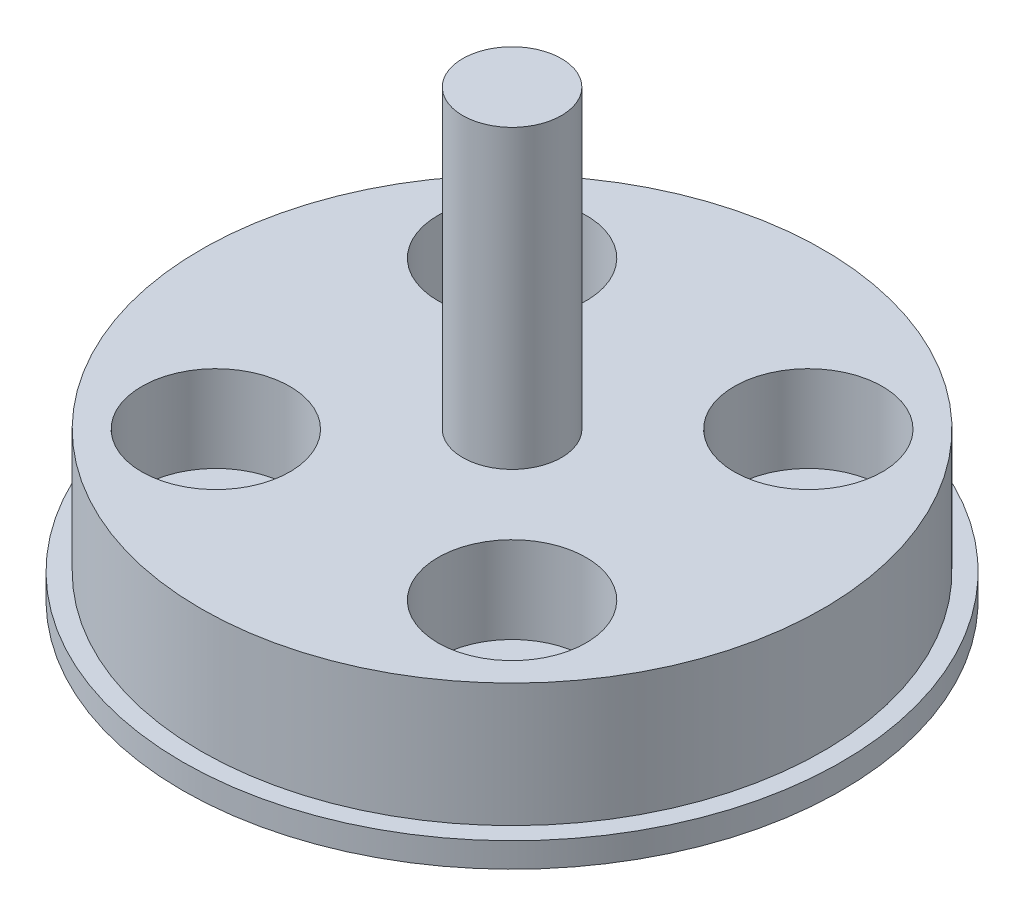
ISO-10303-21;
HEADER;
FILE_DESCRIPTION(('STEP AP214'),'2;1');
FILE_NAME('part.step','',(''),(''),'','','');
FILE_SCHEMA(('AUTOMOTIVE_DESIGN { 1 0 10303 214 1 1 1 1 }'));
ENDSEC;
DATA;
#1=APPLICATION_CONTEXT('core data for automotive mechanical design processes');
#2=APPLICATION_PROTOCOL_DEFINITION('international standard','automotive_design',2000,#1);
#3=PRODUCT_CONTEXT('',#1,'mechanical');
#4=PRODUCT('Part','Part','',(#3));
#5=PRODUCT_RELATED_PRODUCT_CATEGORY('part','',(#4));
#6=PRODUCT_DEFINITION_FORMATION('','',#4);
#7=PRODUCT_DEFINITION_CONTEXT('part definition',#1,'design');
#8=PRODUCT_DEFINITION('design','',#6,#7);
#9=PRODUCT_DEFINITION_SHAPE('','',#8);
#10=(LENGTH_UNIT() NAMED_UNIT(*) SI_UNIT(.MILLI.,.METRE.));
#11=(NAMED_UNIT(*) PLANE_ANGLE_UNIT() SI_UNIT($,.RADIAN.));
#12=(NAMED_UNIT(*) SI_UNIT($,.STERADIAN.) SOLID_ANGLE_UNIT());
#13=UNCERTAINTY_MEASURE_WITH_UNIT(LENGTH_MEASURE(1.E-05),#10,'distance_accuracy_value','');
#14=(GEOMETRIC_REPRESENTATION_CONTEXT(3) GLOBAL_UNCERTAINTY_ASSIGNED_CONTEXT((#13)) GLOBAL_UNIT_ASSIGNED_CONTEXT((#10,
#11,#12)) REPRESENTATION_CONTEXT('',''));
#15=CARTESIAN_POINT('',(0.,0.,0.));
#16=DIRECTION('',(0.,0.,1.));
#17=DIRECTION('',(1.,0.,0.));
#18=AXIS2_PLACEMENT_3D('',#15,#16,#17);
#19=CARTESIAN_POINT('',(-6.00000000000006,34.,5.99999999999994));
#20=DIRECTION('',(0.,-1.,0.));
#21=DIRECTION('',(0.,0.,-1.));
#22=AXIS2_PLACEMENT_3D('',#19,#20,#21);
#23=CYLINDRICAL_SURFACE('',#22,1.575);
#24=CARTESIAN_POINT('',(-6.00000000000006,33.,5.99999999999994));
#25=DIRECTION('',(0.,1.,0.));
#26=DIRECTION('',(0.,0.,1.));
#27=AXIS2_PLACEMENT_3D('',#24,#25,#26);
#28=CIRCLE('',#27,1.575);
#29=CARTESIAN_POINT('',(-6.00000000000006,33.,7.57499999999994));
#30=VERTEX_POINT('',#29);
#31=EDGE_CURVE('E60',#30,#30,#28,.F.);
#32=ORIENTED_EDGE('',*,*,#31,.T.);
#33=EDGE_LOOP('',(#32));
#34=FACE_BOUND('',#33,.T.);
#35=CARTESIAN_POINT('',(-6.00000000000006,35.5,5.99999999999994));
#36=DIRECTION('',(0.,1.,0.));
#37=DIRECTION('',(0.,0.,1.));
#38=AXIS2_PLACEMENT_3D('',#35,#36,#37);
#39=CIRCLE('',#38,1.575);
#40=CARTESIAN_POINT('',(-6.00000000000006,35.5,7.57499999999994));
#41=VERTEX_POINT('',#40);
#42=EDGE_CURVE('E49',#41,#41,#39,.F.);
#43=ORIENTED_EDGE('',*,*,#42,.F.);
#44=EDGE_LOOP('',(#43));
#45=FACE_BOUND('',#44,.T.);
#46=ADVANCED_FACE('F45',(#34,#45),#23,.F.);
#47=CARTESIAN_POINT('',(6.00000000000002,34.,-5.99999999999998));
#48=DIRECTION('',(0.,-1.,0.));
#49=DIRECTION('',(0.,0.,-1.));
#50=AXIS2_PLACEMENT_3D('',#47,#48,#49);
#51=CYLINDRICAL_SURFACE('',#50,1.575);
#52=CARTESIAN_POINT('',(6.00000000000002,33.,-5.99999999999998));
#53=DIRECTION('',(0.,1.,0.));
#54=DIRECTION('',(0.,0.,1.));
#55=AXIS2_PLACEMENT_3D('',#52,#53,#54);
#56=CIRCLE('',#55,1.575);
#57=CARTESIAN_POINT('',(6.00000000000002,33.,-4.42499999999998));
#58=VERTEX_POINT('',#57);
#59=EDGE_CURVE('E74',#58,#58,#56,.F.);
#60=ORIENTED_EDGE('',*,*,#59,.T.);
#61=EDGE_LOOP('',(#60));
#62=FACE_BOUND('',#61,.T.);
#63=CARTESIAN_POINT('',(6.00000000000002,35.5,-5.99999999999998));
#64=DIRECTION('',(0.,1.,0.));
#65=DIRECTION('',(0.,0.,1.));
#66=AXIS2_PLACEMENT_3D('',#63,#64,#65);
#67=CIRCLE('',#66,1.575);
#68=CARTESIAN_POINT('',(6.00000000000002,35.5,-4.42499999999998));
#69=VERTEX_POINT('',#68);
#70=EDGE_CURVE('E89',#69,#69,#67,.F.);
#71=ORIENTED_EDGE('',*,*,#70,.F.);
#72=EDGE_LOOP('',(#71));
#73=FACE_BOUND('',#72,.T.);
#74=ADVANCED_FACE('F185',(#62,#73),#51,.F.);
#75=CARTESIAN_POINT('',(-6.,34.,-6.));
#76=DIRECTION('',(0.,-1.,0.));
#77=DIRECTION('',(0.,0.,-1.));
#78=AXIS2_PLACEMENT_3D('',#75,#76,#77);
#79=CYLINDRICAL_SURFACE('',#78,1.575);
#80=CARTESIAN_POINT('',(-6.,33.,-6.));
#81=DIRECTION('',(0.,1.,0.));
#82=DIRECTION('',(0.,0.,1.));
#83=AXIS2_PLACEMENT_3D('',#80,#81,#82);
#84=CIRCLE('',#83,1.575);
#85=CARTESIAN_POINT('',(-6.,33.,-4.425));
#86=VERTEX_POINT('',#85);
#87=EDGE_CURVE('E70',#86,#86,#84,.F.);
#88=ORIENTED_EDGE('',*,*,#87,.T.);
#89=EDGE_LOOP('',(#88));
#90=FACE_BOUND('',#89,.T.);
#91=CARTESIAN_POINT('',(-6.,35.5,-6.));
#92=DIRECTION('',(0.,1.,0.));
#93=DIRECTION('',(0.,0.,1.));
#94=AXIS2_PLACEMENT_3D('',#91,#92,#93);
#95=CIRCLE('',#94,1.575);
#96=CARTESIAN_POINT('',(-6.,35.5,-4.425));
#97=VERTEX_POINT('',#96);
#98=EDGE_CURVE('E85',#97,#97,#95,.F.);
#99=ORIENTED_EDGE('',*,*,#98,.F.);
#100=EDGE_LOOP('',(#99));
#101=FACE_BOUND('',#100,.T.);
#102=ADVANCED_FACE('F192',(#90,#101),#79,.F.);
#103=CARTESIAN_POINT('',(5.99999999999996,34.,6.00000000000004));
#104=DIRECTION('',(0.,-1.,0.));
#105=DIRECTION('',(0.,0.,-1.));
#106=AXIS2_PLACEMENT_3D('',#103,#104,#105);
#107=CYLINDRICAL_SURFACE('',#106,1.575);
#108=CARTESIAN_POINT('',(5.99999999999996,33.,6.00000000000004));
#109=DIRECTION('',(0.,1.,0.));
#110=DIRECTION('',(0.,0.,1.));
#111=AXIS2_PLACEMENT_3D('',#108,#109,#110);
#112=CIRCLE('',#111,1.575);
#113=CARTESIAN_POINT('',(5.99999999999996,33.,7.57500000000004));
#114=VERTEX_POINT('',#113);
#115=EDGE_CURVE('E66',#114,#114,#112,.F.);
#116=ORIENTED_EDGE('',*,*,#115,.T.);
#117=EDGE_LOOP('',(#116));
#118=FACE_BOUND('',#117,.T.);
#119=CARTESIAN_POINT('',(5.99999999999996,35.5,6.00000000000004));
#120=DIRECTION('',(0.,1.,0.));
#121=DIRECTION('',(0.,0.,1.));
#122=AXIS2_PLACEMENT_3D('',#119,#120,#121);
#123=CIRCLE('',#122,1.575);
#124=CARTESIAN_POINT('',(5.99999999999996,35.5,7.57500000000004));
#125=VERTEX_POINT('',#124);
#126=EDGE_CURVE('E81',#125,#125,#123,.F.);
#127=ORIENTED_EDGE('',*,*,#126,.F.);
#128=EDGE_LOOP('',(#127));
#129=FACE_BOUND('',#128,.T.);
#130=ADVANCED_FACE('F47',(#118,#129),#107,.F.);
#131=CARTESIAN_POINT('',(0.,34.,0.));
#132=DIRECTION('',(0.,-1.,0.));
#133=DIRECTION('',(0.,0.,-1.));
#134=AXIS2_PLACEMENT_3D('',#131,#132,#133);
#135=CYLINDRICAL_SURFACE('',#134,13.35);
#136=CARTESIAN_POINT('',(0.,34.,0.));
#137=DIRECTION('',(0.,1.,0.));
#138=DIRECTION('',(0.,0.,1.));
#139=AXIS2_PLACEMENT_3D('',#136,#137,#138);
#140=CIRCLE('',#139,13.35);
#141=CARTESIAN_POINT('',(0.,34.,13.35));
#142=VERTEX_POINT('',#141);
#143=EDGE_CURVE('E10',#142,#142,#140,.T.);
#144=ORIENTED_EDGE('',*,*,#143,.F.);
#145=EDGE_LOOP('',(#144));
#146=FACE_BOUND('',#145,.T.);
#147=CARTESIAN_POINT('',(0.,33.,0.));
#148=DIRECTION('',(0.,1.,0.));
#149=DIRECTION('',(0.,0.,1.));
#150=AXIS2_PLACEMENT_3D('',#147,#148,#149);
#151=CIRCLE('',#150,13.35);
#152=CARTESIAN_POINT('',(0.,33.,13.35));
#153=VERTEX_POINT('',#152);
#154=EDGE_CURVE('E54',#153,#153,#151,.T.);
#155=ORIENTED_EDGE('',*,*,#154,.T.);
#156=EDGE_LOOP('',(#155));
#157=FACE_BOUND('',#156,.T.);
#158=ADVANCED_FACE('F197',(#146,#157),#135,.T.);
#159=CARTESIAN_POINT('',(0.,34.,0.));
#160=DIRECTION('',(0.,1.,0.));
#161=DIRECTION('',(0.,0.,1.));
#162=AXIS2_PLACEMENT_3D('',#159,#160,#161);
#163=PLANE('',#162);
#164=CARTESIAN_POINT('',(0.,34.,0.));
#165=DIRECTION('',(0.,1.,0.));
#166=DIRECTION('',(0.,0.,1.));
#167=AXIS2_PLACEMENT_3D('',#164,#165,#166);
#168=CIRCLE('',#167,12.6);
#169=CARTESIAN_POINT('',(0.,34.,12.6));
#170=VERTEX_POINT('',#169);
#171=EDGE_CURVE('E64',#170,#170,#168,.F.);
#172=ORIENTED_EDGE('',*,*,#171,.T.);
#173=EDGE_LOOP('',(#172));
#174=FACE_BOUND('',#173,.T.);
#175=ORIENTED_EDGE('',*,*,#143,.T.);
#176=EDGE_LOOP('',(#175));
#177=FACE_BOUND('',#176,.T.);
#178=ADVANCED_FACE('F213',(#174,#177),#163,.T.);
#179=CARTESIAN_POINT('',(0.,33.,0.));
#180=DIRECTION('',(0.,1.,0.));
#181=DIRECTION('',(0.,0.,1.));
#182=AXIS2_PLACEMENT_3D('',#179,#180,#181);
#183=PLANE('',#182);
#184=ORIENTED_EDGE('',*,*,#154,.F.);
#185=EDGE_LOOP('',(#184));
#186=FACE_BOUND('',#185,.T.);
#187=ORIENTED_EDGE('',*,*,#31,.F.);
#188=EDGE_LOOP('',(#187));
#189=FACE_BOUND('',#188,.T.);
#190=ORIENTED_EDGE('',*,*,#59,.F.);
#191=EDGE_LOOP('',(#190));
#192=FACE_BOUND('',#191,.T.);
#193=ORIENTED_EDGE('',*,*,#87,.F.);
#194=EDGE_LOOP('',(#193));
#195=FACE_BOUND('',#194,.T.);
#196=ORIENTED_EDGE('',*,*,#115,.F.);
#197=EDGE_LOOP('',(#196));
#198=FACE_BOUND('',#197,.T.);
#199=ADVANCED_FACE('F210',(#186,#189,#192,#195,#198),#183,.F.);
#200=CARTESIAN_POINT('',(0.,39.,0.));
#201=DIRECTION('',(0.,-1.,0.));
#202=DIRECTION('',(0.,0.,-1.));
#203=AXIS2_PLACEMENT_3D('',#200,#201,#202);
#204=CYLINDRICAL_SURFACE('',#203,12.6);
#205=ORIENTED_EDGE('',*,*,#171,.F.);
#206=EDGE_LOOP('',(#205));
#207=FACE_BOUND('',#206,.T.);
#208=CARTESIAN_POINT('',(0.,39.,0.));
#209=DIRECTION('',(0.,1.,0.));
#210=DIRECTION('',(0.,0.,1.));
#211=AXIS2_PLACEMENT_3D('',#208,#209,#210);
#212=CIRCLE('',#211,12.6);
#213=CARTESIAN_POINT('',(0.,39.,12.6));
#214=VERTEX_POINT('',#213);
#215=EDGE_CURVE('E96',#214,#214,#212,.T.);
#216=ORIENTED_EDGE('',*,*,#215,.F.);
#217=EDGE_LOOP('',(#216));
#218=FACE_BOUND('',#217,.T.);
#219=ADVANCED_FACE('F159',(#207,#218),#204,.T.);
#220=CARTESIAN_POINT('',(0.,39.,0.));
#221=DIRECTION('',(0.,1.,0.));
#222=DIRECTION('',(0.,0.,1.));
#223=AXIS2_PLACEMENT_3D('',#220,#221,#222);
#224=PLANE('',#223);
#225=CARTESIAN_POINT('',(0.,39.,0.));
#226=DIRECTION('',(0.,1.,0.));
#227=DIRECTION('',(0.,0.,1.));
#228=AXIS2_PLACEMENT_3D('',#225,#226,#227);
#229=CIRCLE('',#228,2.);
#230=CARTESIAN_POINT('',(0.,39.,2.00000000000002));
#231=VERTEX_POINT('',#230);
#232=EDGE_CURVE('E138',#231,#231,#229,.T.);
#233=ORIENTED_EDGE('',*,*,#232,.F.);
#234=EDGE_LOOP('',(#233));
#235=FACE_BOUND('',#234,.T.);
#236=CARTESIAN_POINT('',(-6.00000000000006,39.,5.99999999999994));
#237=DIRECTION('',(0.,1.,0.));
#238=DIRECTION('',(0.,0.,1.));
#239=AXIS2_PLACEMENT_3D('',#236,#237,#238);
#240=CIRCLE('',#239,3.);
#241=CARTESIAN_POINT('',(-6.00000000000006,39.,8.99999999999994));
#242=VERTEX_POINT('',#241);
#243=EDGE_CURVE('E118',#242,#242,#240,.T.);
#244=ORIENTED_EDGE('',*,*,#243,.F.);
#245=EDGE_LOOP('',(#244));
#246=FACE_BOUND('',#245,.T.);
#247=CARTESIAN_POINT('',(5.99999999999996,39.,6.00000000000004));
#248=DIRECTION('',(0.,1.,0.));
#249=DIRECTION('',(0.,0.,1.));
#250=AXIS2_PLACEMENT_3D('',#247,#248,#249);
#251=CIRCLE('',#250,3.);
#252=CARTESIAN_POINT('',(5.99999999999996,39.,9.00000000000004));
#253=VERTEX_POINT('',#252);
#254=EDGE_CURVE('E127',#253,#253,#251,.T.);
#255=ORIENTED_EDGE('',*,*,#254,.F.);
#256=EDGE_LOOP('',(#255));
#257=FACE_BOUND('',#256,.T.);
#258=CARTESIAN_POINT('',(6.00000000000002,39.,-5.99999999999998));
#259=DIRECTION('',(0.,1.,0.));
#260=DIRECTION('',(0.,0.,1.));
#261=AXIS2_PLACEMENT_3D('',#258,#259,#260);
#262=CIRCLE('',#261,3.);
#263=CARTESIAN_POINT('',(6.00000000000002,39.,-2.99999999999998));
#264=VERTEX_POINT('',#263);
#265=EDGE_CURVE('E110',#264,#264,#262,.T.);
#266=ORIENTED_EDGE('',*,*,#265,.F.);
#267=EDGE_LOOP('',(#266));
#268=FACE_BOUND('',#267,.T.);
#269=CARTESIAN_POINT('',(-6.,39.,-6.));
#270=DIRECTION('',(0.,1.,0.));
#271=DIRECTION('',(0.,0.,1.));
#272=AXIS2_PLACEMENT_3D('',#269,#270,#271);
#273=CIRCLE('',#272,3.);
#274=CARTESIAN_POINT('',(-6.,39.,-3.));
#275=VERTEX_POINT('',#274);
#276=EDGE_CURVE('E106',#275,#275,#273,.T.);
#277=ORIENTED_EDGE('',*,*,#276,.F.);
#278=EDGE_LOOP('',(#277));
#279=FACE_BOUND('',#278,.T.);
#280=ORIENTED_EDGE('',*,*,#215,.T.);
#281=EDGE_LOOP('',(#280));
#282=FACE_BOUND('',#281,.T.);
#283=ADVANCED_FACE('F155',(#235,#246,#257,#268,#279,#282),#224,.T.);
#284=CARTESIAN_POINT('',(-6.,35.5,-6.));
#285=DIRECTION('',(0.,1.,0.));
#286=DIRECTION('',(0.,0.,1.));
#287=AXIS2_PLACEMENT_3D('',#284,#285,#286);
#288=PLANE('',#287);
#289=CARTESIAN_POINT('',(-6.,35.5,-6.));
#290=DIRECTION('',(0.,1.,0.));
#291=DIRECTION('',(0.,0.,1.));
#292=AXIS2_PLACEMENT_3D('',#289,#290,#291);
#293=CIRCLE('',#292,3.);
#294=CARTESIAN_POINT('',(-6.,35.5,-3.));
#295=VERTEX_POINT('',#294);
#296=EDGE_CURVE('E86',#295,#295,#293,.T.);
#297=ORIENTED_EDGE('',*,*,#296,.T.);
#298=EDGE_LOOP('',(#297));
#299=FACE_BOUND('',#298,.T.);
#300=ORIENTED_EDGE('',*,*,#98,.T.);
#301=EDGE_LOOP('',(#300));
#302=FACE_BOUND('',#301,.T.);
#303=ADVANCED_FACE('F158',(#299,#302),#288,.T.);
#304=CARTESIAN_POINT('',(-6.,35.5,-6.));
#305=DIRECTION('',(0.,1.,0.));
#306=DIRECTION('',(0.,0.,1.));
#307=AXIS2_PLACEMENT_3D('',#304,#305,#306);
#308=CYLINDRICAL_SURFACE('',#307,3.);
#309=ORIENTED_EDGE('',*,*,#296,.F.);
#310=EDGE_LOOP('',(#309));
#311=FACE_BOUND('',#310,.T.);
#312=ORIENTED_EDGE('',*,*,#276,.T.);
#313=EDGE_LOOP('',(#312));
#314=FACE_BOUND('',#313,.T.);
#315=ADVANCED_FACE('F169',(#311,#314),#308,.F.);
#316=CARTESIAN_POINT('',(6.00000000000002,35.5,-5.99999999999998));
#317=DIRECTION('',(0.,1.,0.));
#318=DIRECTION('',(0.,0.,1.));
#319=AXIS2_PLACEMENT_3D('',#316,#317,#318);
#320=PLANE('',#319);
#321=CARTESIAN_POINT('',(6.00000000000002,35.5,-5.99999999999998));
#322=DIRECTION('',(0.,1.,0.));
#323=DIRECTION('',(0.,0.,1.));
#324=AXIS2_PLACEMENT_3D('',#321,#322,#323);
#325=CIRCLE('',#324,3.);
#326=CARTESIAN_POINT('',(6.00000000000002,35.5,-2.99999999999998));
#327=VERTEX_POINT('',#326);
#328=EDGE_CURVE('E131',#327,#327,#325,.T.);
#329=ORIENTED_EDGE('',*,*,#328,.T.);
#330=EDGE_LOOP('',(#329));
#331=FACE_BOUND('',#330,.T.);
#332=ORIENTED_EDGE('',*,*,#70,.T.);
#333=EDGE_LOOP('',(#332));
#334=FACE_BOUND('',#333,.T.);
#335=ADVANCED_FACE('F171',(#331,#334),#320,.T.);
#336=CARTESIAN_POINT('',(6.00000000000002,35.5,-5.99999999999998));
#337=DIRECTION('',(0.,1.,0.));
#338=DIRECTION('',(0.,0.,1.));
#339=AXIS2_PLACEMENT_3D('',#336,#337,#338);
#340=CYLINDRICAL_SURFACE('',#339,3.);
#341=ORIENTED_EDGE('',*,*,#328,.F.);
#342=EDGE_LOOP('',(#341));
#343=FACE_BOUND('',#342,.T.);
#344=ORIENTED_EDGE('',*,*,#265,.T.);
#345=EDGE_LOOP('',(#344));
#346=FACE_BOUND('',#345,.T.);
#347=ADVANCED_FACE('F178',(#343,#346),#340,.F.);
#348=CARTESIAN_POINT('',(5.99999999999996,35.5,6.00000000000004));
#349=DIRECTION('',(0.,1.,0.));
#350=DIRECTION('',(0.,0.,1.));
#351=AXIS2_PLACEMENT_3D('',#348,#349,#350);
#352=PLANE('',#351);
#353=CARTESIAN_POINT('',(5.99999999999996,35.5,6.00000000000004));
#354=DIRECTION('',(0.,1.,0.));
#355=DIRECTION('',(0.,0.,1.));
#356=AXIS2_PLACEMENT_3D('',#353,#354,#355);
#357=CIRCLE('',#356,3.);
#358=CARTESIAN_POINT('',(5.99999999999996,35.5,9.00000000000004));
#359=VERTEX_POINT('',#358);
#360=EDGE_CURVE('E123',#359,#359,#357,.T.);
#361=ORIENTED_EDGE('',*,*,#360,.T.);
#362=EDGE_LOOP('',(#361));
#363=FACE_BOUND('',#362,.T.);
#364=ORIENTED_EDGE('',*,*,#126,.T.);
#365=EDGE_LOOP('',(#364));
#366=FACE_BOUND('',#365,.T.);
#367=ADVANCED_FACE('F219',(#363,#366),#352,.T.);
#368=CARTESIAN_POINT('',(5.99999999999996,35.5,6.00000000000004));
#369=DIRECTION('',(0.,1.,0.));
#370=DIRECTION('',(0.,0.,1.));
#371=AXIS2_PLACEMENT_3D('',#368,#369,#370);
#372=CYLINDRICAL_SURFACE('',#371,3.);
#373=ORIENTED_EDGE('',*,*,#360,.F.);
#374=EDGE_LOOP('',(#373));
#375=FACE_BOUND('',#374,.T.);
#376=ORIENTED_EDGE('',*,*,#254,.T.);
#377=EDGE_LOOP('',(#376));
#378=FACE_BOUND('',#377,.T.);
#379=ADVANCED_FACE('F221',(#375,#378),#372,.F.);
#380=CARTESIAN_POINT('',(-6.00000000000006,35.5,5.99999999999994));
#381=DIRECTION('',(0.,1.,0.));
#382=DIRECTION('',(0.,0.,1.));
#383=AXIS2_PLACEMENT_3D('',#380,#381,#382);
#384=PLANE('',#383);
#385=CARTESIAN_POINT('',(-6.00000000000006,35.5,5.99999999999994));
#386=DIRECTION('',(0.,1.,0.));
#387=DIRECTION('',(0.,0.,1.));
#388=AXIS2_PLACEMENT_3D('',#385,#386,#387);
#389=CIRCLE('',#388,3.);
#390=CARTESIAN_POINT('',(-6.00000000000006,35.5,8.99999999999994));
#391=VERTEX_POINT('',#390);
#392=EDGE_CURVE('E114',#391,#391,#389,.T.);
#393=ORIENTED_EDGE('',*,*,#392,.T.);
#394=EDGE_LOOP('',(#393));
#395=FACE_BOUND('',#394,.T.);
#396=ORIENTED_EDGE('',*,*,#42,.T.);
#397=EDGE_LOOP('',(#396));
#398=FACE_BOUND('',#397,.T.);
#399=ADVANCED_FACE('F228',(#395,#398),#384,.T.);
#400=CARTESIAN_POINT('',(-6.00000000000006,35.5,5.99999999999994));
#401=DIRECTION('',(0.,1.,0.));
#402=DIRECTION('',(0.,0.,1.));
#403=AXIS2_PLACEMENT_3D('',#400,#401,#402);
#404=CYLINDRICAL_SURFACE('',#403,3.);
#405=ORIENTED_EDGE('',*,*,#392,.F.);
#406=EDGE_LOOP('',(#405));
#407=FACE_BOUND('',#406,.T.);
#408=ORIENTED_EDGE('',*,*,#243,.T.);
#409=EDGE_LOOP('',(#408));
#410=FACE_BOUND('',#409,.T.);
#411=ADVANCED_FACE('F151',(#407,#410),#404,.F.);
#412=CARTESIAN_POINT('',(0.,51.,0.));
#413=DIRECTION('',(0.,-1.,0.));
#414=DIRECTION('',(0.,0.,-1.));
#415=AXIS2_PLACEMENT_3D('',#412,#413,#414);
#416=CYLINDRICAL_SURFACE('',#415,2.);
#417=CARTESIAN_POINT('',(0.,51.,0.));
#418=DIRECTION('',(0.,1.,0.));
#419=DIRECTION('',(0.,0.,1.));
#420=AXIS2_PLACEMENT_3D('',#417,#418,#419);
#421=CIRCLE('',#420,2.);
#422=CARTESIAN_POINT('',(0.,51.,2.00000000000002));
#423=VERTEX_POINT('',#422);
#424=EDGE_CURVE('E119',#423,#423,#421,.T.);
#425=ORIENTED_EDGE('',*,*,#424,.F.);
#426=EDGE_LOOP('',(#425));
#427=FACE_BOUND('',#426,.T.);
#428=ORIENTED_EDGE('',*,*,#232,.T.);
#429=EDGE_LOOP('',(#428));
#430=FACE_BOUND('',#429,.T.);
#431=ADVANCED_FACE('F148',(#427,#430),#416,.T.);
#432=CARTESIAN_POINT('',(0.,51.,0.));
#433=DIRECTION('',(0.,1.,0.));
#434=DIRECTION('',(0.,0.,1.));
#435=AXIS2_PLACEMENT_3D('',#432,#433,#434);
#436=PLANE('',#435);
#437=ORIENTED_EDGE('',*,*,#424,.T.);
#438=EDGE_LOOP('',(#437));
#439=FACE_BOUND('',#438,.T.);
#440=ADVANCED_FACE('F146',(#439),#436,.T.);
#441=CLOSED_SHELL('',(#46,#74,#102,#130,#158,#178,#199,#219,#283,#303,#315,#335,#347,#367,#379,
#399,#411,#431,#440));
#442=MANIFOLD_SOLID_BREP('B2',#441);
#443=ADVANCED_BREP_SHAPE_REPRESENTATION('',(#18,#442),#14);
#444=SHAPE_DEFINITION_REPRESENTATION(#9,#443);
ENDSEC;
END-ISO-10303-21;
